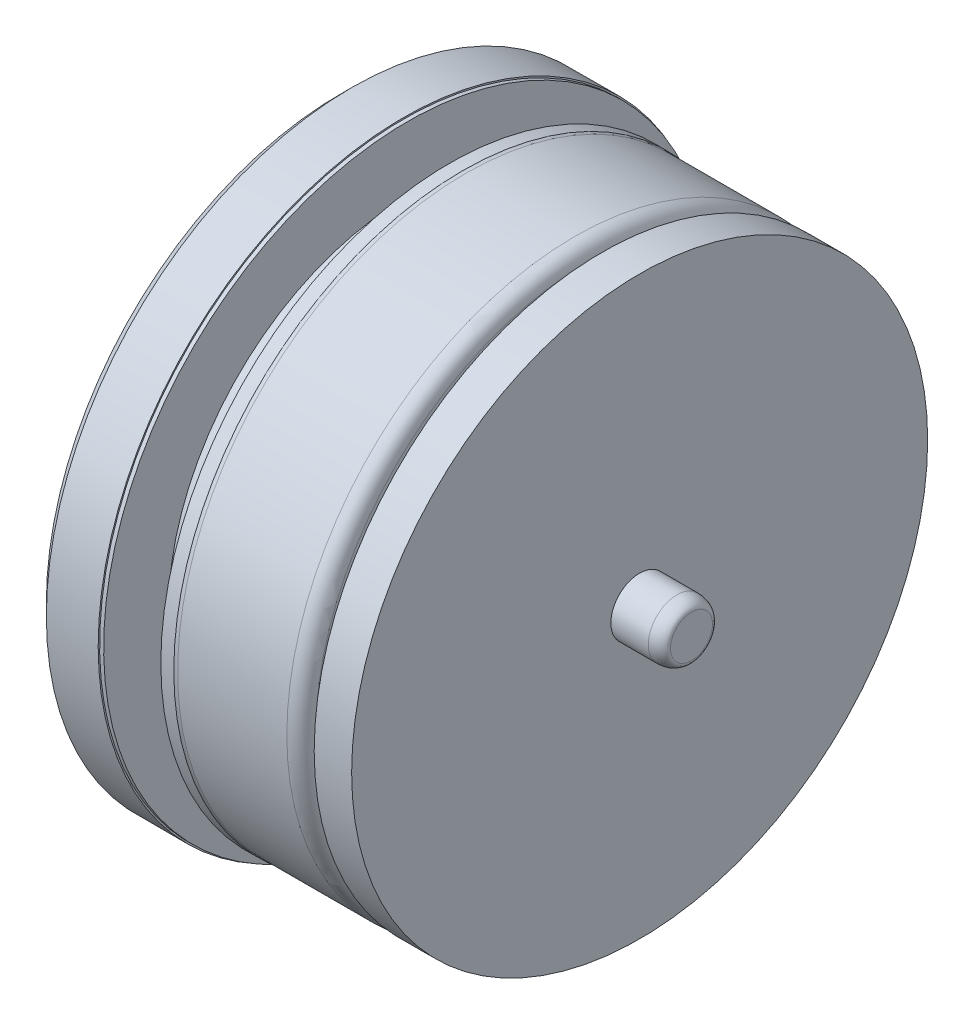
ISO-10303-21;
HEADER;
FILE_DESCRIPTION(('STEP AP214'),'2;1');
FILE_NAME('part.step','',(''),(''),'','','');
FILE_SCHEMA(('AUTOMOTIVE_DESIGN { 1 0 10303 214 1 1 1 1 }'));
ENDSEC;
DATA;
#1=APPLICATION_CONTEXT('core data for automotive mechanical design processes');
#2=APPLICATION_PROTOCOL_DEFINITION('international standard','automotive_design',2000,#1);
#3=PRODUCT_CONTEXT('',#1,'mechanical');
#4=PRODUCT('Part','Part','',(#3));
#5=PRODUCT_RELATED_PRODUCT_CATEGORY('part','',(#4));
#6=PRODUCT_DEFINITION_FORMATION('','',#4);
#7=PRODUCT_DEFINITION_CONTEXT('part definition',#1,'design');
#8=PRODUCT_DEFINITION('design','',#6,#7);
#9=PRODUCT_DEFINITION_SHAPE('','',#8);
#10=(LENGTH_UNIT() NAMED_UNIT(*) SI_UNIT(.MILLI.,.METRE.));
#11=(NAMED_UNIT(*) PLANE_ANGLE_UNIT() SI_UNIT($,.RADIAN.));
#12=(NAMED_UNIT(*) SI_UNIT($,.STERADIAN.) SOLID_ANGLE_UNIT());
#13=UNCERTAINTY_MEASURE_WITH_UNIT(LENGTH_MEASURE(1.E-05),#10,'distance_accuracy_value','');
#14=(GEOMETRIC_REPRESENTATION_CONTEXT(3) GLOBAL_UNCERTAINTY_ASSIGNED_CONTEXT((#13)) GLOBAL_UNIT_ASSIGNED_CONTEXT((#10,
#11,#12)) REPRESENTATION_CONTEXT('',''));
#15=CARTESIAN_POINT('',(0.,0.,0.));
#16=DIRECTION('',(0.,0.,1.));
#17=DIRECTION('',(1.,0.,0.));
#18=AXIS2_PLACEMENT_3D('',#15,#16,#17);
#19=CARTESIAN_POINT('',(10.,0.,0.));
#20=DIRECTION('',(-1.,0.,0.));
#21=DIRECTION('',(0.,0.,1.));
#22=AXIS2_PLACEMENT_3D('',#19,#20,#21);
#23=PLANE('',#22);
#24=CARTESIAN_POINT('',(10.,0.,0.));
#25=DIRECTION('',(-1.,0.,0.));
#26=DIRECTION('',(0.,1.,0.));
#27=AXIS2_PLACEMENT_3D('',#24,#25,#26);
#28=CIRCLE('',#27,0.73);
#29=CARTESIAN_POINT('',(10.,0.73,0.));
#30=VERTEX_POINT('',#29);
#31=CARTESIAN_POINT('',(10.,-0.73,0.));
#32=VERTEX_POINT('',#31);
#33=EDGE_CURVE('E85',#30,#32,#28,.T.);
#34=ORIENTED_EDGE('',*,*,#33,.F.);
#35=CARTESIAN_POINT('',(10.,0.,0.));
#36=DIRECTION('',(-1.,0.,0.));
#37=DIRECTION('',(0.,-1.,0.));
#38=AXIS2_PLACEMENT_3D('',#35,#36,#37);
#39=CIRCLE('',#38,0.73);
#40=EDGE_CURVE('E809',#32,#30,#39,.T.);
#41=ORIENTED_EDGE('',*,*,#40,.F.);
#42=EDGE_LOOP('',(#34,#41));
#43=FACE_BOUND('',#42,.T.);
#44=ADVANCED_FACE('F15',(#43),#23,.F.);
#45=CARTESIAN_POINT('',(10.,0.73,0.));
#46=CARTESIAN_POINT('',(10.,0.7941666666667,0.));
#47=CARTESIAN_POINT('',(9.943068193887,0.8655681938875,0.));
#48=CARTESIAN_POINT('',(9.787543930705,0.9667105973716,0.));
#49=CARTESIAN_POINT('',(9.628333333333,1.,0.));
#50=CARTESIAN_POINT('',(9.5,1.,0.));
#51=(BOUNDED_CURVE() B_SPLINE_CURVE(3,(#45,#46,#47,#48,#49,#50),.UNSPECIFIED.,.F.,
.F.) B_SPLINE_CURVE_WITH_KNOTS((4,1,1,4),(0.,0.25,0.5,1.),
.UNSPECIFIED.) CURVE() GEOMETRIC_REPRESENTATION_ITEM() RATIONAL_B_SPLINE_CURVE((1.,1.,1.,1.,1.,1.)) REPRESENTATION_ITEM(''));
#52=CARTESIAN_POINT('',(10.925,0.,0.));
#53=DIRECTION('',(1.,0.,0.));
#54=AXIS1_PLACEMENT('',#52,#53);
#55=SURFACE_OF_REVOLUTION('',#51,#54);
#56=CARTESIAN_POINT('',(9.5,0.,0.));
#57=DIRECTION('',(-1.,0.,0.));
#58=DIRECTION('',(0.,0.,1.));
#59=AXIS2_PLACEMENT_3D('',#56,#57,#58);
#60=CIRCLE('',#59,1.);
#61=CARTESIAN_POINT('',(9.5,0.,1.));
#62=VERTEX_POINT('',#61);
#63=EDGE_CURVE('E267',#62,#62,#60,.T.);
#64=ORIENTED_EDGE('',*,*,#63,.F.);
#65=EDGE_LOOP('',(#64));
#66=FACE_BOUND('',#65,.T.);
#67=ORIENTED_EDGE('',*,*,#40,.T.);
#68=ORIENTED_EDGE('',*,*,#33,.T.);
#69=EDGE_LOOP('',(#67,#68));
#70=FACE_BOUND('',#69,.T.);
#71=ADVANCED_FACE('F272',(#66,#70),#55,.F.);
#72=CARTESIAN_POINT('',(10.925,0.,0.));
#73=DIRECTION('',(-1.,0.,0.));
#74=DIRECTION('',(0.,0.,1.));
#75=AXIS2_PLACEMENT_3D('',#72,#73,#74);
#76=CYLINDRICAL_SURFACE('',#75,1.);
#77=CARTESIAN_POINT('',(8.2,0.,0.));
#78=DIRECTION('',(-1.,0.,0.));
#79=DIRECTION('',(0.,0.,1.));
#80=AXIS2_PLACEMENT_3D('',#77,#78,#79);
#81=CIRCLE('',#80,1.);
#82=CARTESIAN_POINT('',(8.2,0.,1.));
#83=VERTEX_POINT('',#82);
#84=EDGE_CURVE('E772',#83,#83,#81,.F.);
#85=ORIENTED_EDGE('',*,*,#84,.T.);
#86=EDGE_LOOP('',(#85));
#87=FACE_BOUND('',#86,.T.);
#88=ORIENTED_EDGE('',*,*,#63,.T.);
#89=EDGE_LOOP('',(#88));
#90=FACE_BOUND('',#89,.T.);
#91=ADVANCED_FACE('F276',(#87,#90),#76,.T.);
#92=CARTESIAN_POINT('',(8.2,0.,0.));
#93=DIRECTION('',(-1.,0.,0.));
#94=DIRECTION('',(0.,0.,1.));
#95=AXIS2_PLACEMENT_3D('',#92,#93,#94);
#96=PLANE('',#95);
#97=ORIENTED_EDGE('',*,*,#84,.F.);
#98=EDGE_LOOP('',(#97));
#99=FACE_BOUND('',#98,.T.);
#100=CARTESIAN_POINT('',(8.2,0.,0.));
#101=DIRECTION('',(-1.,0.,0.));
#102=DIRECTION('',(0.,0.,1.));
#103=AXIS2_PLACEMENT_3D('',#100,#101,#102);
#104=CIRCLE('',#103,10.);
#105=CARTESIAN_POINT('',(8.2,0.,10.));
#106=VERTEX_POINT('',#105);
#107=EDGE_CURVE('E769',#106,#106,#104,.T.);
#108=ORIENTED_EDGE('',*,*,#107,.F.);
#109=EDGE_LOOP('',(#108));
#110=FACE_BOUND('',#109,.T.);
#111=ADVANCED_FACE('F327',(#99,#110),#96,.F.);
#112=CARTESIAN_POINT('',(10.925,0.,0.));
#113=DIRECTION('',(-1.,0.,0.));
#114=DIRECTION('',(0.,0.,1.));
#115=AXIS2_PLACEMENT_3D('',#112,#113,#114);
#116=CYLINDRICAL_SURFACE('',#115,10.);
#117=CARTESIAN_POINT('',(6.9,0.,0.));
#118=DIRECTION('',(-1.,0.,0.));
#119=DIRECTION('',(0.,0.,1.));
#120=AXIS2_PLACEMENT_3D('',#117,#118,#119);
#121=CIRCLE('',#120,10.);
#122=CARTESIAN_POINT('',(6.9,0.,10.));
#123=VERTEX_POINT('',#122);
#124=EDGE_CURVE('E765',#123,#123,#121,.T.);
#125=ORIENTED_EDGE('',*,*,#124,.F.);
#126=EDGE_LOOP('',(#125));
#127=FACE_BOUND('',#126,.T.);
#128=ORIENTED_EDGE('',*,*,#107,.T.);
#129=EDGE_LOOP('',(#128));
#130=FACE_BOUND('',#129,.T.);
#131=ADVANCED_FACE('F335',(#127,#130),#116,.T.);
#132=CARTESIAN_POINT('',(-8.5,0.,0.));
#133=DIRECTION('',(-1.,0.,0.));
#134=DIRECTION('',(0.,0.,1.));
#135=AXIS2_PLACEMENT_3D('',#132,#133,#134);
#136=PLANE('',#135);
#137=CARTESIAN_POINT('',(-8.5,0.,0.));
#138=DIRECTION('',(1.,0.,0.));
#139=DIRECTION('',(0.,1.,0.));
#140=AXIS2_PLACEMENT_3D('',#137,#138,#139);
#141=CIRCLE('',#140,0.73);
#142=CARTESIAN_POINT('',(-8.5,0.73,0.));
#143=VERTEX_POINT('',#142);
#144=CARTESIAN_POINT('',(-8.5,-0.73,0.));
#145=VERTEX_POINT('',#144);
#146=EDGE_CURVE('E768',#143,#145,#141,.T.);
#147=ORIENTED_EDGE('',*,*,#146,.F.);
#148=CARTESIAN_POINT('',(-8.5,0.,0.));
#149=DIRECTION('',(1.,0.,0.));
#150=DIRECTION('',(0.,-1.,0.));
#151=AXIS2_PLACEMENT_3D('',#148,#149,#150);
#152=CIRCLE('',#151,0.73);
#153=EDGE_CURVE('E764',#145,#143,#152,.T.);
#154=ORIENTED_EDGE('',*,*,#153,.F.);
#155=EDGE_LOOP('',(#147,#154));
#156=FACE_BOUND('',#155,.T.);
#157=ADVANCED_FACE('F344',(#156),#136,.T.);
#158=CARTESIAN_POINT('',(6.9,0.,0.));
#159=DIRECTION('',(-1.,0.,0.));
#160=DIRECTION('',(0.,0.,1.));
#161=AXIS2_PLACEMENT_3D('',#158,#159,#160);
#162=PLANE('',#161);
#163=CARTESIAN_POINT('',(6.89999999999973,0.,0.));
#164=DIRECTION('',(-1.,0.,0.));
#165=DIRECTION('',(0.,0.,1.));
#166=AXIS2_PLACEMENT_3D('',#163,#164,#165);
#167=CIRCLE('',#166,8.76019237886453);
#168=CARTESIAN_POINT('',(6.89999999999973,0.,8.76019237886453));
#169=VERTEX_POINT('',#168);
#170=EDGE_CURVE('E761',#169,#169,#167,.T.);
#171=ORIENTED_EDGE('',*,*,#170,.F.);
#172=EDGE_LOOP('',(#171));
#173=FACE_BOUND('',#172,.T.);
#174=ORIENTED_EDGE('',*,*,#124,.T.);
#175=EDGE_LOOP('',(#174));
#176=FACE_BOUND('',#175,.T.);
#177=ADVANCED_FACE('F243',(#173,#176),#162,.T.);
#178=CARTESIAN_POINT('',(-8.,1.,0.));
#179=CARTESIAN_POINT('',(-8.128333333333,1.,0.));
#180=CARTESIAN_POINT('',(-8.287543930705,0.9667105973716,0.));
#181=CARTESIAN_POINT('',(-8.443068193887,0.8655681938875,0.));
#182=CARTESIAN_POINT('',(-8.5,0.7941666666666,0.));
#183=CARTESIAN_POINT('',(-8.5,0.73,0.));
#184=(BOUNDED_CURVE() B_SPLINE_CURVE(3,(#178,#179,#180,#181,#182,#183),.UNSPECIFIED.,.F.,
.F.) B_SPLINE_CURVE_WITH_KNOTS((4,1,1,4),(0.,0.5,0.75,1.),
.UNSPECIFIED.) CURVE() GEOMETRIC_REPRESENTATION_ITEM() RATIONAL_B_SPLINE_CURVE((1.,1.,1.,1.,1.,1.)) REPRESENTATION_ITEM(''));
#185=CARTESIAN_POINT('',(10.925,0.,0.));
#186=DIRECTION('',(1.,0.,0.));
#187=AXIS1_PLACEMENT('',#185,#186);
#188=SURFACE_OF_REVOLUTION('',#184,#187);
#189=ORIENTED_EDGE('',*,*,#146,.T.);
#190=ORIENTED_EDGE('',*,*,#153,.T.);
#191=EDGE_LOOP('',(#189,#190));
#192=FACE_BOUND('',#191,.T.);
#193=CARTESIAN_POINT('',(-8.,0.,0.));
#194=DIRECTION('',(-1.,0.,0.));
#195=DIRECTION('',(0.,0.,1.));
#196=AXIS2_PLACEMENT_3D('',#193,#194,#195);
#197=CIRCLE('',#196,1.);
#198=CARTESIAN_POINT('',(-8.,0.,1.));
#199=VERTEX_POINT('',#198);
#200=EDGE_CURVE('E232',#199,#199,#197,.F.);
#201=ORIENTED_EDGE('',*,*,#200,.F.);
#202=EDGE_LOOP('',(#201));
#203=FACE_BOUND('',#202,.T.);
#204=ADVANCED_FACE('F238',(#192,#203),#188,.F.);
#205=CARTESIAN_POINT('',(6.44999999999984,0.,0.));
#206=DIRECTION('',(-1.,0.,0.));
#207=DIRECTION('',(0.,0.,1.));
#208=AXIS2_PLACEMENT_3D('',#205,#206,#207);
#209=CONICAL_SURFACE('',#208,9.01999999999973,0.523598775598197);
#210=ORIENTED_EDGE('',*,*,#170,.T.);
#211=EDGE_LOOP('',(#210));
#212=FACE_BOUND('',#211,.T.);
#213=CARTESIAN_POINT('',(6.44999999999984,0.,0.));
#214=DIRECTION('',(-1.,0.,0.));
#215=DIRECTION('',(0.,0.,1.));
#216=AXIS2_PLACEMENT_3D('',#213,#214,#215);
#217=CIRCLE('',#216,9.01999999999973);
#218=CARTESIAN_POINT('',(6.44999999999984,0.,9.01999999999973));
#219=VERTEX_POINT('',#218);
#220=EDGE_CURVE('E758',#219,#219,#217,.F.);
#221=ORIENTED_EDGE('',*,*,#220,.T.);
#222=EDGE_LOOP('',(#221));
#223=FACE_BOUND('',#222,.T.);
#224=ADVANCED_FACE('F242',(#212,#223),#209,.T.);
#225=CARTESIAN_POINT('',(10.925,0.,0.));
#226=DIRECTION('',(-1.,0.,0.));
#227=DIRECTION('',(0.,0.,1.));
#228=AXIS2_PLACEMENT_3D('',#225,#226,#227);
#229=CYLINDRICAL_SURFACE('',#228,1.);
#230=CARTESIAN_POINT('',(-2.7,0.,0.));
#231=DIRECTION('',(-1.,0.,0.));
#232=DIRECTION('',(0.,0.,1.));
#233=AXIS2_PLACEMENT_3D('',#230,#231,#232);
#234=CIRCLE('',#233,1.);
#235=CARTESIAN_POINT('',(-2.7,0.,1.));
#236=VERTEX_POINT('',#235);
#237=EDGE_CURVE('E755',#236,#236,#234,.F.);
#238=ORIENTED_EDGE('',*,*,#237,.F.);
#239=EDGE_LOOP('',(#238));
#240=FACE_BOUND('',#239,.T.);
#241=ORIENTED_EDGE('',*,*,#200,.T.);
#242=EDGE_LOOP('',(#241));
#243=FACE_BOUND('',#242,.T.);
#244=ADVANCED_FACE('F206',(#240,#243),#229,.T.);
#245=CARTESIAN_POINT('',(6.45,0.,0.));
#246=DIRECTION('',(-1.,0.,0.));
#247=DIRECTION('',(0.,0.,1.));
#248=AXIS2_PLACEMENT_3D('',#245,#246,#247);
#249=PLANE('',#248);
#250=ORIENTED_EDGE('',*,*,#220,.F.);
#251=EDGE_LOOP('',(#250));
#252=FACE_BOUND('',#251,.T.);
#253=CARTESIAN_POINT('',(6.45,0.,0.));
#254=DIRECTION('',(-1.,0.,0.));
#255=DIRECTION('',(0.,-1.,0.));
#256=AXIS2_PLACEMENT_3D('',#253,#254,#255);
#257=CIRCLE('',#256,9.5);
#258=CARTESIAN_POINT('',(6.45,-9.5,0.));
#259=VERTEX_POINT('',#258);
#260=CARTESIAN_POINT('',(6.45,9.5,0.));
#261=VERTEX_POINT('',#260);
#262=EDGE_CURVE('E192',#259,#261,#257,.T.);
#263=ORIENTED_EDGE('',*,*,#262,.F.);
#264=CARTESIAN_POINT('',(6.45,0.,0.));
#265=DIRECTION('',(-1.,0.,0.));
#266=DIRECTION('',(0.,1.,0.));
#267=AXIS2_PLACEMENT_3D('',#264,#265,#266);
#268=CIRCLE('',#267,9.5);
#269=EDGE_CURVE('E219',#261,#259,#268,.T.);
#270=ORIENTED_EDGE('',*,*,#269,.F.);
#271=EDGE_LOOP('',(#263,#270));
#272=FACE_BOUND('',#271,.T.);
#273=ADVANCED_FACE('F197',(#252,#272),#249,.F.);
#274=CARTESIAN_POINT('',(-2.7,0.,0.));
#275=DIRECTION('',(-1.,0.,0.));
#276=DIRECTION('',(0.,0.,1.));
#277=AXIS2_PLACEMENT_3D('',#274,#275,#276);
#278=PLANE('',#277);
#279=ORIENTED_EDGE('',*,*,#237,.T.);
#280=EDGE_LOOP('',(#279));
#281=FACE_BOUND('',#280,.T.);
#282=CARTESIAN_POINT('',(-2.70000000000437,0.,0.));
#283=DIRECTION('',(-1.,0.,0.));
#284=DIRECTION('',(0.,0.,1.));
#285=AXIS2_PLACEMENT_3D('',#282,#283,#284);
#286=CIRCLE('',#285,3.00000000004274);
#287=CARTESIAN_POINT('',(-2.70000000000437,0.,3.00000000004274));
#288=VERTEX_POINT('',#287);
#289=EDGE_CURVE('E752',#288,#288,#286,.T.);
#290=ORIENTED_EDGE('',*,*,#289,.T.);
#291=EDGE_LOOP('',(#290));
#292=FACE_BOUND('',#291,.T.);
#293=ADVANCED_FACE('F178',(#281,#292),#278,.T.);
#294=CARTESIAN_POINT('',(5.95,0.,0.));
#295=DIRECTION('',(-1.,0.,0.));
#296=DIRECTION('',(0.,1.,0.));
#297=AXIS2_PLACEMENT_3D('',#294,#295,#296);
#298=TOROIDAL_SURFACE('',#297,9.5,0.5);
#299=CARTESIAN_POINT('',(5.95,0.,0.));
#300=DIRECTION('',(-1.,0.,0.));
#301=DIRECTION('',(0.,0.,1.));
#302=AXIS2_PLACEMENT_3D('',#299,#300,#301);
#303=CIRCLE('',#302,10.);
#304=CARTESIAN_POINT('',(5.95,0.,10.));
#305=VERTEX_POINT('',#304);
#306=EDGE_CURVE('E186',#305,#305,#303,.T.);
#307=ORIENTED_EDGE('',*,*,#306,.F.);
#308=EDGE_LOOP('',(#307));
#309=FACE_BOUND('',#308,.T.);
#310=ORIENTED_EDGE('',*,*,#269,.T.);
#311=ORIENTED_EDGE('',*,*,#262,.T.);
#312=EDGE_LOOP('',(#310,#311));
#313=FACE_BOUND('',#312,.T.);
#314=ADVANCED_FACE('F172',(#309,#313),#298,.T.);
#315=CARTESIAN_POINT('',(-3.19999999999254,0.,0.));
#316=DIRECTION('',(-1.,0.,0.));
#317=DIRECTION('',(0.,0.,1.));
#318=AXIS2_PLACEMENT_3D('',#315,#316,#317);
#319=CONICAL_SURFACE('',#318,3.28867513462683,0.523598775592442);
#320=ORIENTED_EDGE('',*,*,#289,.F.);
#321=EDGE_LOOP('',(#320));
#322=FACE_BOUND('',#321,.T.);
#323=CARTESIAN_POINT('',(-3.19999999999254,0.,0.));
#324=DIRECTION('',(-1.,0.,0.));
#325=DIRECTION('',(0.,0.,1.));
#326=AXIS2_PLACEMENT_3D('',#323,#324,#325);
#327=CIRCLE('',#326,3.28867513462683);
#328=CARTESIAN_POINT('',(-3.19999999999254,0.,3.28867513462683));
#329=VERTEX_POINT('',#328);
#330=EDGE_CURVE('E749',#329,#329,#327,.F.);
#331=ORIENTED_EDGE('',*,*,#330,.F.);
#332=EDGE_LOOP('',(#331));
#333=FACE_BOUND('',#332,.T.);
#334=ADVANCED_FACE('F168',(#322,#333),#319,.F.);
#335=CARTESIAN_POINT('',(10.925,0.,0.));
#336=DIRECTION('',(-1.,0.,0.));
#337=DIRECTION('',(0.,0.,1.));
#338=AXIS2_PLACEMENT_3D('',#335,#336,#337);
#339=CYLINDRICAL_SURFACE('',#338,10.);
#340=CARTESIAN_POINT('',(2.158972473588,0.,0.));
#341=DIRECTION('',(-1.,0.,0.));
#342=DIRECTION('',(0.,1.,0.));
#343=AXIS2_PLACEMENT_3D('',#340,#341,#342);
#344=CIRCLE('',#343,10.);
#345=CARTESIAN_POINT('',(2.158972473588,10.,0.));
#346=VERTEX_POINT('',#345);
#347=EDGE_CURVE('E748',#346,#346,#344,.F.);
#348=ORIENTED_EDGE('',*,*,#347,.T.);
#349=EDGE_LOOP('',(#348));
#350=FACE_BOUND('',#349,.T.);
#351=ORIENTED_EDGE('',*,*,#306,.T.);
#352=EDGE_LOOP('',(#351));
#353=FACE_BOUND('',#352,.T.);
#354=ADVANCED_FACE('F164',(#350,#353),#339,.T.);
#355=CARTESIAN_POINT('',(-3.2,0.,0.));
#356=DIRECTION('',(-1.,0.,0.));
#357=DIRECTION('',(0.,0.,1.));
#358=AXIS2_PLACEMENT_3D('',#355,#356,#357);
#359=PLANE('',#358);
#360=ORIENTED_EDGE('',*,*,#330,.T.);
#361=EDGE_LOOP('',(#360));
#362=FACE_BOUND('',#361,.T.);
#363=CARTESIAN_POINT('',(-3.2,0.,0.));
#364=DIRECTION('',(-1.,0.,0.));
#365=DIRECTION('',(0.,0.,1.));
#366=AXIS2_PLACEMENT_3D('',#363,#364,#365);
#367=CIRCLE('',#366,4.);
#368=CARTESIAN_POINT('',(-3.2,0.,4.));
#369=VERTEX_POINT('',#368);
#370=EDGE_CURVE('E744',#369,#369,#367,.F.);
#371=ORIENTED_EDGE('',*,*,#370,.F.);
#372=EDGE_LOOP('',(#371));
#373=FACE_BOUND('',#372,.T.);
#374=ADVANCED_FACE('F160',(#362,#373),#359,.T.);
#375=CARTESIAN_POINT('',(2.60000000008631,6.75,0.));
#376=DIRECTION('',(-1.,0.,0.));
#377=DIRECTION('',(0.,0.,1.));
#378=AXIS2_PLACEMENT_3D('',#375,#376,#377);
#379=CONICAL_SURFACE('',#378,0.799999999866941,1.0297442585965);
#380=CARTESIAN_POINT('',(3.08068849528809,6.75000000020987,0.));
#381=VERTEX_POINT('',#380);
#382=VERTEX_LOOP('',#381);
#383=FACE_BOUND('',#382,.T.);
#384=CARTESIAN_POINT('',(2.6,6.75,0.));
#385=DIRECTION('',(-1.,0.,0.));
#386=DIRECTION('',(0.,0.,1.));
#387=AXIS2_PLACEMENT_3D('',#384,#385,#386);
#388=CIRCLE('',#387,0.8);
#389=CARTESIAN_POINT('',(2.6,6.75,0.8));
#390=VERTEX_POINT('',#389);
#391=EDGE_CURVE('E747',#390,#390,#388,.T.);
#392=ORIENTED_EDGE('',*,*,#391,.T.);
#393=EDGE_LOOP('',(#392));
#394=FACE_BOUND('',#393,.T.);
#395=ADVANCED_FACE('F156',(#383,#394),#379,.F.);
#396=CARTESIAN_POINT('',(2.59999999997263,-3.375,-5.845671475545));
#397=DIRECTION('',(-1.,0.,0.));
#398=DIRECTION('',(0.,0.,1.));
#399=AXIS2_PLACEMENT_3D('',#396,#397,#398);
#400=CONICAL_SURFACE('',#399,0.800000000040061,1.02974425869595);
#401=CARTESIAN_POINT('',(3.0806884951744,-3.375,-5.845671475545));
#402=VERTEX_POINT('',#401);
#403=VERTEX_LOOP('',#402);
#404=FACE_BOUND('',#403,.T.);
#405=CARTESIAN_POINT('',(2.6,-3.375,-5.845671475545));
#406=DIRECTION('',(-1.,0.,0.));
#407=DIRECTION('',(0.,0.,1.));
#408=AXIS2_PLACEMENT_3D('',#405,#406,#407);
#409=CIRCLE('',#408,0.8);
#410=CARTESIAN_POINT('',(2.6,-3.375,-5.045671475545));
#411=VERTEX_POINT('',#410);
#412=EDGE_CURVE('E857',#411,#411,#409,.T.);
#413=ORIENTED_EDGE('',*,*,#412,.T.);
#414=EDGE_LOOP('',(#413));
#415=FACE_BOUND('',#414,.T.);
#416=ADVANCED_FACE('F153',(#404,#415),#400,.F.);
#417=CARTESIAN_POINT('',(2.59999999997263,-3.375,5.845671475545));
#418=DIRECTION('',(-1.,0.,0.));
#419=DIRECTION('',(0.,0.,1.));
#420=AXIS2_PLACEMENT_3D('',#417,#418,#419);
#421=CONICAL_SURFACE('',#420,0.800000000040061,1.02974425869595);
#422=CARTESIAN_POINT('',(3.0806884951744,-3.375,5.845671475545));
#423=VERTEX_POINT('',#422);
#424=VERTEX_LOOP('',#423);
#425=FACE_BOUND('',#424,.T.);
#426=CARTESIAN_POINT('',(2.6,-3.375,5.845671475545));
#427=DIRECTION('',(-1.,0.,0.));
#428=DIRECTION('',(0.,0.,1.));
#429=AXIS2_PLACEMENT_3D('',#426,#427,#428);
#430=CIRCLE('',#429,0.8);
#431=CARTESIAN_POINT('',(2.6,-3.375,6.645671475545));
#432=VERTEX_POINT('',#431);
#433=EDGE_CURVE('E128',#432,#432,#430,.T.);
#434=ORIENTED_EDGE('',*,*,#433,.T.);
#435=EDGE_LOOP('',(#434));
#436=FACE_BOUND('',#435,.T.);
#437=ADVANCED_FACE('F149',(#425,#436),#421,.F.);
#438=CARTESIAN_POINT('',(0.,0.,0.));
#439=DIRECTION('',(-1.,0.,0.));
#440=DIRECTION('',(0.,0.,1.));
#441=AXIS2_PLACEMENT_3D('',#438,#439,#440);
#442=PLANE('',#441);
#443=CARTESIAN_POINT('',(0.,2.35,4.070319397787));
#444=DIRECTION('',(1.,0.,0.));
#445=DIRECTION('',(0.,0.,-1.));
#446=AXIS2_PLACEMENT_3D('',#443,#444,#445);
#447=CIRCLE('',#446,0.4);
#448=CARTESIAN_POINT('',(0.,2.35,3.670319397787));
#449=VERTEX_POINT('',#448);
#450=EDGE_CURVE('E741',#449,#449,#447,.F.);
#451=ORIENTED_EDGE('',*,*,#450,.T.);
#452=EDGE_LOOP('',(#451));
#453=FACE_BOUND('',#452,.T.);
#454=ADVANCED_FACE('F145',(#453),#442,.T.);
#455=CARTESIAN_POINT('',(0.,0.,0.));
#456=DIRECTION('',(-1.,0.,0.));
#457=DIRECTION('',(0.,0.,1.));
#458=AXIS2_PLACEMENT_3D('',#455,#456,#457);
#459=PLANE('',#458);
#460=CARTESIAN_POINT('',(0.,-4.7,0.));
#461=DIRECTION('',(1.,0.,0.));
#462=DIRECTION('',(0.,0.,-1.));
#463=AXIS2_PLACEMENT_3D('',#460,#461,#462);
#464=CIRCLE('',#463,0.4);
#465=CARTESIAN_POINT('',(0.,-4.7,-0.4));
#466=VERTEX_POINT('',#465);
#467=EDGE_CURVE('E738',#466,#466,#464,.F.);
#468=ORIENTED_EDGE('',*,*,#467,.T.);
#469=EDGE_LOOP('',(#468));
#470=FACE_BOUND('',#469,.T.);
#471=ADVANCED_FACE('F141',(#470),#459,.T.);
#472=CARTESIAN_POINT('',(0.,0.,0.));
#473=DIRECTION('',(-1.,0.,0.));
#474=DIRECTION('',(0.,0.,1.));
#475=AXIS2_PLACEMENT_3D('',#472,#473,#474);
#476=PLANE('',#475);
#477=CARTESIAN_POINT('',(0.,2.35,-4.070319397787));
#478=DIRECTION('',(1.,0.,0.));
#479=DIRECTION('',(0.,0.,-1.));
#480=AXIS2_PLACEMENT_3D('',#477,#478,#479);
#481=CIRCLE('',#480,0.4);
#482=CARTESIAN_POINT('',(0.,2.35,-4.470319397787));
#483=VERTEX_POINT('',#482);
#484=EDGE_CURVE('E125',#483,#483,#481,.F.);
#485=ORIENTED_EDGE('',*,*,#484,.T.);
#486=EDGE_LOOP('',(#485));
#487=FACE_BOUND('',#486,.T.);
#488=ADVANCED_FACE('F136',(#487),#476,.T.);
#489=CARTESIAN_POINT('',(2.158972473588,0.,0.));
#490=DIRECTION('',(-1.,0.,0.));
#491=DIRECTION('',(0.,1.,0.));
#492=AXIS2_PLACEMENT_3D('',#489,#490,#491);
#493=TOROIDAL_SURFACE('',#492,10.25,0.25);
#494=CARTESIAN_POINT('',(2.05,0.,0.));
#495=DIRECTION('',(-1.,0.,0.));
#496=DIRECTION('',(0.,0.,1.));
#497=AXIS2_PLACEMENT_3D('',#494,#495,#496);
#498=CIRCLE('',#497,10.025);
#499=CARTESIAN_POINT('',(2.05,0.,10.025));
#500=VERTEX_POINT('',#499);
#501=EDGE_CURVE('E121',#500,#500,#498,.T.);
#502=ORIENTED_EDGE('',*,*,#501,.F.);
#503=EDGE_LOOP('',(#502));
#504=FACE_BOUND('',#503,.T.);
#505=ORIENTED_EDGE('',*,*,#347,.F.);
#506=EDGE_LOOP('',(#505));
#507=FACE_BOUND('',#506,.T.);
#508=ADVANCED_FACE('F131',(#504,#507),#493,.F.);
#509=CARTESIAN_POINT('',(10.925,0.,0.));
#510=DIRECTION('',(-1.,0.,0.));
#511=DIRECTION('',(0.,0.,1.));
#512=AXIS2_PLACEMENT_3D('',#509,#510,#511);
#513=CYLINDRICAL_SURFACE('',#512,4.);
#514=CARTESIAN_POINT('',(-2.2,0.,0.));
#515=DIRECTION('',(-1.,0.,0.));
#516=DIRECTION('',(0.,0.,1.));
#517=AXIS2_PLACEMENT_3D('',#514,#515,#516);
#518=CIRCLE('',#517,4.);
#519=CARTESIAN_POINT('',(-2.2,0.,4.));
#520=VERTEX_POINT('',#519);
#521=EDGE_CURVE('E124',#520,#520,#518,.F.);
#522=ORIENTED_EDGE('',*,*,#521,.F.);
#523=EDGE_LOOP('',(#522));
#524=FACE_BOUND('',#523,.T.);
#525=ORIENTED_EDGE('',*,*,#370,.T.);
#526=EDGE_LOOP('',(#525));
#527=FACE_BOUND('',#526,.T.);
#528=ADVANCED_FACE('F135',(#524,#527),#513,.T.);
#529=CARTESIAN_POINT('',(3.344722919983,6.75,0.));
#530=DIRECTION('',(-1.,0.,0.));
#531=DIRECTION('',(0.,0.,1.));
#532=AXIS2_PLACEMENT_3D('',#529,#530,#531);
#533=CYLINDRICAL_SURFACE('',#532,0.8);
#534=ORIENTED_EDGE('',*,*,#391,.F.);
#535=EDGE_LOOP('',(#534));
#536=FACE_BOUND('',#535,.T.);
#537=CARTESIAN_POINT('',(-2.2,6.75,0.));
#538=DIRECTION('',(-1.,0.,0.));
#539=DIRECTION('',(0.,0.,1.));
#540=AXIS2_PLACEMENT_3D('',#537,#538,#539);
#541=CIRCLE('',#540,0.8);
#542=CARTESIAN_POINT('',(-2.2,6.75,0.8));
#543=VERTEX_POINT('',#542);
#544=EDGE_CURVE('E731',#543,#543,#541,.F.);
#545=ORIENTED_EDGE('',*,*,#544,.F.);
#546=EDGE_LOOP('',(#545));
#547=FACE_BOUND('',#546,.T.);
#548=ADVANCED_FACE('F444',(#536,#547),#533,.F.);
#549=CARTESIAN_POINT('',(3.344722919983,-3.375,-5.845671475545));
#550=DIRECTION('',(-1.,0.,0.));
#551=DIRECTION('',(0.,0.,1.));
#552=AXIS2_PLACEMENT_3D('',#549,#550,#551);
#553=CYLINDRICAL_SURFACE('',#552,0.8);
#554=ORIENTED_EDGE('',*,*,#412,.F.);
#555=EDGE_LOOP('',(#554));
#556=FACE_BOUND('',#555,.T.);
#557=CARTESIAN_POINT('',(-2.2,-3.375,-5.845671475545));
#558=DIRECTION('',(-1.,0.,0.));
#559=DIRECTION('',(0.,0.,1.));
#560=AXIS2_PLACEMENT_3D('',#557,#558,#559);
#561=CIRCLE('',#560,0.8);
#562=CARTESIAN_POINT('',(-2.2,-3.375,-5.045671475545));
#563=VERTEX_POINT('',#562);
#564=EDGE_CURVE('E728',#563,#563,#561,.F.);
#565=ORIENTED_EDGE('',*,*,#564,.F.);
#566=EDGE_LOOP('',(#565));
#567=FACE_BOUND('',#566,.T.);
#568=ADVANCED_FACE('F452',(#556,#567),#553,.F.);
#569=CARTESIAN_POINT('',(3.344722919983,-3.375,5.845671475545));
#570=DIRECTION('',(-1.,0.,0.));
#571=DIRECTION('',(0.,0.,1.));
#572=AXIS2_PLACEMENT_3D('',#569,#570,#571);
#573=CYLINDRICAL_SURFACE('',#572,0.8);
#574=ORIENTED_EDGE('',*,*,#433,.F.);
#575=EDGE_LOOP('',(#574));
#576=FACE_BOUND('',#575,.T.);
#577=CARTESIAN_POINT('',(-2.2,-3.375,5.845671475545));
#578=DIRECTION('',(-1.,0.,0.));
#579=DIRECTION('',(0.,0.,1.));
#580=AXIS2_PLACEMENT_3D('',#577,#578,#579);
#581=CIRCLE('',#580,0.8);
#582=CARTESIAN_POINT('',(-2.2,-3.375,6.645671475545));
#583=VERTEX_POINT('',#582);
#584=EDGE_CURVE('E725',#583,#583,#581,.F.);
#585=ORIENTED_EDGE('',*,*,#584,.F.);
#586=EDGE_LOOP('',(#585));
#587=FACE_BOUND('',#586,.T.);
#588=ADVANCED_FACE('F460',(#576,#587),#573,.F.);
#589=CARTESIAN_POINT('',(-2.2,2.35,4.070319397787));
#590=DIRECTION('',(1.,0.,0.));
#591=DIRECTION('',(0.,0.,-1.));
#592=AXIS2_PLACEMENT_3D('',#589,#590,#591);
#593=CYLINDRICAL_SURFACE('',#592,0.4);
#594=ORIENTED_EDGE('',*,*,#450,.F.);
#595=EDGE_LOOP('',(#594));
#596=FACE_BOUND('',#595,.T.);
#597=CARTESIAN_POINT('',(-2.2,2.35,4.070319397787));
#598=DIRECTION('',(1.,0.,0.));
#599=DIRECTION('',(0.,0.,-1.));
#600=AXIS2_PLACEMENT_3D('',#597,#598,#599);
#601=CIRCLE('',#600,0.4);
#602=CARTESIAN_POINT('',(-2.2,2.35,3.670319397787));
#603=VERTEX_POINT('',#602);
#604=EDGE_CURVE('E722',#603,#603,#601,.T.);
#605=ORIENTED_EDGE('',*,*,#604,.F.);
#606=EDGE_LOOP('',(#605));
#607=FACE_BOUND('',#606,.T.);
#608=ADVANCED_FACE('F469',(#596,#607),#593,.F.);
#609=CARTESIAN_POINT('',(-2.2,-4.7,0.));
#610=DIRECTION('',(1.,0.,0.));
#611=DIRECTION('',(0.,0.,-1.));
#612=AXIS2_PLACEMENT_3D('',#609,#610,#611);
#613=CYLINDRICAL_SURFACE('',#612,0.4);
#614=ORIENTED_EDGE('',*,*,#467,.F.);
#615=EDGE_LOOP('',(#614));
#616=FACE_BOUND('',#615,.T.);
#617=CARTESIAN_POINT('',(-2.2,-4.7,0.));
#618=DIRECTION('',(1.,0.,0.));
#619=DIRECTION('',(0.,0.,-1.));
#620=AXIS2_PLACEMENT_3D('',#617,#618,#619);
#621=CIRCLE('',#620,0.4);
#622=CARTESIAN_POINT('',(-2.2,-4.7,-0.4));
#623=VERTEX_POINT('',#622);
#624=EDGE_CURVE('E719',#623,#623,#621,.T.);
#625=ORIENTED_EDGE('',*,*,#624,.F.);
#626=EDGE_LOOP('',(#625));
#627=FACE_BOUND('',#626,.T.);
#628=ADVANCED_FACE('F478',(#616,#627),#613,.F.);
#629=CARTESIAN_POINT('',(-2.2,2.35,-4.070319397787));
#630=DIRECTION('',(1.,0.,0.));
#631=DIRECTION('',(0.,0.,-1.));
#632=AXIS2_PLACEMENT_3D('',#629,#630,#631);
#633=CYLINDRICAL_SURFACE('',#632,0.4);
#634=ORIENTED_EDGE('',*,*,#484,.F.);
#635=EDGE_LOOP('',(#634));
#636=FACE_BOUND('',#635,.T.);
#637=CARTESIAN_POINT('',(-2.2,2.35,-4.070319397787));
#638=DIRECTION('',(1.,0.,0.));
#639=DIRECTION('',(0.,0.,-1.));
#640=AXIS2_PLACEMENT_3D('',#637,#638,#639);
#641=CIRCLE('',#640,0.4);
#642=CARTESIAN_POINT('',(-2.2,2.35,-4.470319397787));
#643=VERTEX_POINT('',#642);
#644=EDGE_CURVE('E716',#643,#643,#641,.T.);
#645=ORIENTED_EDGE('',*,*,#644,.F.);
#646=EDGE_LOOP('',(#645));
#647=FACE_BOUND('',#646,.T.);
#648=ADVANCED_FACE('F487',(#636,#647),#633,.F.);
#649=CARTESIAN_POINT('',(10.925,0.,0.));
#650=DIRECTION('',(-1.,0.,0.));
#651=DIRECTION('',(0.,0.,1.));
#652=AXIS2_PLACEMENT_3D('',#649,#650,#651);
#653=CYLINDRICAL_SURFACE('',#652,10.025);
#654=CARTESIAN_POINT('',(1.6,0.,0.));
#655=DIRECTION('',(-1.,0.,0.));
#656=DIRECTION('',(0.,0.,1.));
#657=AXIS2_PLACEMENT_3D('',#654,#655,#656);
#658=CIRCLE('',#657,10.025);
#659=CARTESIAN_POINT('',(1.6,0.,10.025));
#660=VERTEX_POINT('',#659);
#661=EDGE_CURVE('E713',#660,#660,#658,.T.);
#662=ORIENTED_EDGE('',*,*,#661,.F.);
#663=EDGE_LOOP('',(#662));
#664=FACE_BOUND('',#663,.T.);
#665=ORIENTED_EDGE('',*,*,#501,.T.);
#666=EDGE_LOOP('',(#665));
#667=FACE_BOUND('',#666,.T.);
#668=ADVANCED_FACE('F496',(#664,#667),#653,.T.);
#669=CARTESIAN_POINT('',(-2.2,0.,0.));
#670=DIRECTION('',(-1.,0.,0.));
#671=DIRECTION('',(0.,0.,1.));
#672=AXIS2_PLACEMENT_3D('',#669,#670,#671);
#673=PLANE('',#672);
#674=CARTESIAN_POINT('',(-2.2,0.,0.));
#675=DIRECTION('',(-1.,0.,0.));
#676=DIRECTION('',(0.,0.,1.));
#677=AXIS2_PLACEMENT_3D('',#674,#675,#676);
#678=CIRCLE('',#677,10.2);
#679=CARTESIAN_POINT('',(-2.2,0.,10.2));
#680=VERTEX_POINT('',#679);
#681=EDGE_CURVE('E10',#680,#680,#678,.T.);
#682=ORIENTED_EDGE('',*,*,#681,.T.);
#683=EDGE_LOOP('',(#682));
#684=FACE_BOUND('',#683,.T.);
#685=ORIENTED_EDGE('',*,*,#644,.T.);
#686=EDGE_LOOP('',(#685));
#687=FACE_BOUND('',#686,.T.);
#688=ORIENTED_EDGE('',*,*,#624,.T.);
#689=EDGE_LOOP('',(#688));
#690=FACE_BOUND('',#689,.T.);
#691=ORIENTED_EDGE('',*,*,#604,.T.);
#692=EDGE_LOOP('',(#691));
#693=FACE_BOUND('',#692,.T.);
#694=ORIENTED_EDGE('',*,*,#584,.T.);
#695=EDGE_LOOP('',(#694));
#696=FACE_BOUND('',#695,.T.);
#697=ORIENTED_EDGE('',*,*,#564,.T.);
#698=EDGE_LOOP('',(#697));
#699=FACE_BOUND('',#698,.T.);
#700=ORIENTED_EDGE('',*,*,#544,.T.);
#701=EDGE_LOOP('',(#700));
#702=FACE_BOUND('',#701,.T.);
#703=ORIENTED_EDGE('',*,*,#521,.T.);
#704=EDGE_LOOP('',(#703));
#705=FACE_BOUND('',#704,.T.);
#706=ADVANCED_FACE('F505',(#684,#687,#690,#693,#696,#699,#702,#705),#673,.T.);
#707=CARTESIAN_POINT('',(1.6,0.,0.));
#708=DIRECTION('',(-1.,0.,0.));
#709=DIRECTION('',(0.,0.,1.));
#710=AXIS2_PLACEMENT_3D('',#707,#708,#709);
#711=PLANE('',#710);
#712=CARTESIAN_POINT('',(1.6,0.,0.));
#713=DIRECTION('',(-1.,0.,0.));
#714=DIRECTION('',(0.,0.,1.));
#715=AXIS2_PLACEMENT_3D('',#712,#713,#714);
#716=CIRCLE('',#715,9.4);
#717=CARTESIAN_POINT('',(1.6,0.,9.4));
#718=VERTEX_POINT('',#717);
#719=EDGE_CURVE('E120',#718,#718,#716,.T.);
#720=ORIENTED_EDGE('',*,*,#719,.F.);
#721=EDGE_LOOP('',(#720));
#722=FACE_BOUND('',#721,.T.);
#723=ORIENTED_EDGE('',*,*,#661,.T.);
#724=EDGE_LOOP('',(#723));
#725=FACE_BOUND('',#724,.T.);
#726=ADVANCED_FACE('F513',(#722,#725),#711,.T.);
#727=CARTESIAN_POINT('',(10.925,0.,0.));
#728=DIRECTION('',(-1.,0.,0.));
#729=DIRECTION('',(0.,0.,1.));
#730=AXIS2_PLACEMENT_3D('',#727,#728,#729);
#731=CYLINDRICAL_SURFACE('',#730,10.6);
#732=CARTESIAN_POINT('',(-1.8,0.,0.));
#733=DIRECTION('',(-1.,0.,0.));
#734=DIRECTION('',(0.,0.,1.));
#735=AXIS2_PLACEMENT_3D('',#732,#733,#734);
#736=CIRCLE('',#735,10.6);
#737=CARTESIAN_POINT('',(-1.8,0.,10.6));
#738=VERTEX_POINT('',#737);
#739=EDGE_CURVE('E23',#738,#738,#736,.F.);
#740=ORIENTED_EDGE('',*,*,#739,.T.);
#741=EDGE_LOOP('',(#740));
#742=FACE_BOUND('',#741,.T.);
#743=CARTESIAN_POINT('',(0.,0.,0.));
#744=DIRECTION('',(-1.,0.,0.));
#745=DIRECTION('',(0.,0.,1.));
#746=AXIS2_PLACEMENT_3D('',#743,#744,#745);
#747=CIRCLE('',#746,10.6);
#748=CARTESIAN_POINT('',(0.,-10.1666120217105,3.));
#749=VERTEX_POINT('',#748);
#750=CARTESIAN_POINT('',(0.,-10.1666120217105,-3.));
#751=VERTEX_POINT('',#750);
#752=EDGE_CURVE('E98',#749,#751,#747,.T.);
#753=ORIENTED_EDGE('',*,*,#752,.T.);
#754=DIRECTION('',(-1.,0.,0.));
#755=VECTOR('',#754,1.);
#756=CARTESIAN_POINT('',(10.0012539936204,-10.1666120217105,-3.));
#757=LINE('',#756,#755);
#758=CARTESIAN_POINT('',(0.14,-10.1666120217105,-3.));
#759=VERTEX_POINT('',#758);
#760=EDGE_CURVE('E30',#759,#751,#757,.T.);
#761=ORIENTED_EDGE('',*,*,#760,.F.);
#762=CARTESIAN_POINT('',(0.14,0.,0.));
#763=DIRECTION('',(-1.,0.,0.));
#764=DIRECTION('',(0.,0.,1.));
#765=AXIS2_PLACEMENT_3D('',#762,#763,#764);
#766=CIRCLE('',#765,10.5999999999995);
#767=CARTESIAN_POINT('',(0.14,-10.1666120217105,3.));
#768=VERTEX_POINT('',#767);
#769=EDGE_CURVE('E90',#768,#759,#766,.F.);
#770=ORIENTED_EDGE('',*,*,#769,.F.);
#771=DIRECTION('',(-1.,0.,0.));
#772=VECTOR('',#771,1.);
#773=CARTESIAN_POINT('',(10.0012539936204,-10.1666120217105,3.));
#774=LINE('',#773,#772);
#775=EDGE_CURVE('E95',#768,#749,#774,.T.);
#776=ORIENTED_EDGE('',*,*,#775,.T.);
#777=EDGE_LOOP('',(#753,#761,#770,#776));
#778=FACE_BOUND('',#777,.T.);
#779=ADVANCED_FACE('F97',(#742,#778),#731,.T.);
#780=CARTESIAN_POINT('',(10.925,0.,0.));
#781=DIRECTION('',(-1.,0.,0.));
#782=DIRECTION('',(0.,0.,1.));
#783=AXIS2_PLACEMENT_3D('',#780,#781,#782);
#784=CYLINDRICAL_SURFACE('',#783,9.4);
#785=CARTESIAN_POINT('',(1.35,0.,0.));
#786=DIRECTION('',(-1.,0.,0.));
#787=DIRECTION('',(0.,0.,1.));
#788=AXIS2_PLACEMENT_3D('',#785,#786,#787);
#789=CIRCLE('',#788,9.4);
#790=CARTESIAN_POINT('',(1.35,0.,9.4));
#791=VERTEX_POINT('',#790);
#792=EDGE_CURVE('E108',#791,#791,#789,.T.);
#793=ORIENTED_EDGE('',*,*,#792,.F.);
#794=EDGE_LOOP('',(#793));
#795=FACE_BOUND('',#794,.T.);
#796=ORIENTED_EDGE('',*,*,#719,.T.);
#797=EDGE_LOOP('',(#796));
#798=FACE_BOUND('',#797,.T.);
#799=ADVANCED_FACE('F529',(#795,#798),#784,.T.);
#800=CARTESIAN_POINT('',(0.,0.,0.));
#801=DIRECTION('',(-1.,0.,0.));
#802=DIRECTION('',(0.,0.,1.));
#803=AXIS2_PLACEMENT_3D('',#800,#801,#802);
#804=PLANE('',#803);
#805=ORIENTED_EDGE('',*,*,#752,.F.);
#806=DIRECTION('',(0.,1.,0.));
#807=VECTOR('',#806,1.);
#808=CARTESIAN_POINT('',(0.,-10.11446983287,3.));
#809=LINE('',#808,#807);
#810=CARTESIAN_POINT('',(0.,-10.1144698328682,2.99999999999975));
#811=VERTEX_POINT('',#810);
#812=EDGE_CURVE('E105',#811,#749,#809,.F.);
#813=ORIENTED_EDGE('',*,*,#812,.F.);
#814=CARTESIAN_POINT('',(0.,0.,0.));
#815=DIRECTION('',(-1.,0.,0.));
#816=DIRECTION('',(0.,0.,1.));
#817=AXIS2_PLACEMENT_3D('',#814,#815,#816);
#818=CIRCLE('',#817,10.55);
#819=CARTESIAN_POINT('',(0.,-10.1144698328691,-3.));
#820=VERTEX_POINT('',#819);
#821=EDGE_CURVE('E52',#820,#811,#818,.F.);
#822=ORIENTED_EDGE('',*,*,#821,.F.);
#823=DIRECTION('',(0.,1.,0.));
#824=VECTOR('',#823,1.);
#825=CARTESIAN_POINT('',(0.,0.,-3.));
#826=LINE('',#825,#824);
#827=EDGE_CURVE('E107',#751,#820,#826,.T.);
#828=ORIENTED_EDGE('',*,*,#827,.F.);
#829=EDGE_LOOP('',(#805,#813,#822,#828));
#830=FACE_BOUND('',#829,.T.);
#831=ADVANCED_FACE('F104',(#830),#804,.F.);
#832=CARTESIAN_POINT('',(1.35,0.,0.));
#833=DIRECTION('',(-1.,0.,0.));
#834=DIRECTION('',(0.,0.,1.));
#835=AXIS2_PLACEMENT_3D('',#832,#833,#834);
#836=PLANE('',#835);
#837=CARTESIAN_POINT('',(1.35,0.,0.));
#838=DIRECTION('',(-1.,0.,0.));
#839=DIRECTION('',(0.,0.,1.));
#840=AXIS2_PLACEMENT_3D('',#837,#838,#839);
#841=CIRCLE('',#840,8.3);
#842=CARTESIAN_POINT('',(1.35,0.,8.3));
#843=VERTEX_POINT('',#842);
#844=EDGE_CURVE('E700',#843,#843,#841,.T.);
#845=ORIENTED_EDGE('',*,*,#844,.F.);
#846=EDGE_LOOP('',(#845));
#847=FACE_BOUND('',#846,.T.);
#848=ORIENTED_EDGE('',*,*,#792,.T.);
#849=EDGE_LOOP('',(#848));
#850=FACE_BOUND('',#849,.T.);
#851=ADVANCED_FACE('F544',(#847,#850),#836,.T.);
#852=CARTESIAN_POINT('',(0.,-10.11446983287,3.));
#853=DIRECTION('',(0.,0.,1.));
#854=DIRECTION('',(1.,0.,0.));
#855=AXIS2_PLACEMENT_3D('',#852,#853,#854);
#856=PLANE('',#855);
#857=ORIENTED_EDGE('',*,*,#775,.F.);
#858=DIRECTION('',(0.,1.,0.));
#859=VECTOR('',#858,1.);
#860=CARTESIAN_POINT('',(0.14,0.,3.));
#861=LINE('',#860,#859);
#862=CARTESIAN_POINT('',(0.14,-10.1144698328682,2.99999999999975));
#863=VERTEX_POINT('',#862);
#864=EDGE_CURVE('E709',#768,#863,#861,.T.);
#865=ORIENTED_EDGE('',*,*,#864,.T.);
#866=DIRECTION('',(-1.,0.,0.));
#867=VECTOR('',#866,1.);
#868=CARTESIAN_POINT('',(10.925,-10.1144698328683,2.9999999999995));
#869=LINE('',#868,#867);
#870=EDGE_CURVE('E111',#811,#863,#869,.F.);
#871=ORIENTED_EDGE('',*,*,#870,.F.);
#872=ORIENTED_EDGE('',*,*,#812,.T.);
#873=EDGE_LOOP('',(#857,#865,#871,#872));
#874=FACE_BOUND('',#873,.T.);
#875=ADVANCED_FACE('F110',(#874),#856,.T.);
#876=CARTESIAN_POINT('',(10.925,0.,0.));
#877=DIRECTION('',(-1.,0.,0.));
#878=DIRECTION('',(0.,0.,1.));
#879=AXIS2_PLACEMENT_3D('',#876,#877,#878);
#880=CYLINDRICAL_SURFACE('',#879,10.55);
#881=ORIENTED_EDGE('',*,*,#870,.T.);
#882=CARTESIAN_POINT('',(0.14,0.,0.));
#883=DIRECTION('',(-1.,0.,0.));
#884=DIRECTION('',(0.,0.,1.));
#885=AXIS2_PLACEMENT_3D('',#882,#883,#884);
#886=CIRCLE('',#885,10.55);
#887=CARTESIAN_POINT('',(0.14,-10.1144698328691,-3.));
#888=VERTEX_POINT('',#887);
#889=EDGE_CURVE('E704',#863,#888,#886,.T.);
#890=ORIENTED_EDGE('',*,*,#889,.T.);
#891=DIRECTION('',(-1.,0.,0.));
#892=VECTOR('',#891,1.);
#893=CARTESIAN_POINT('',(0.,-10.11446983287,-3.));
#894=LINE('',#893,#892);
#895=EDGE_CURVE('E39',#820,#888,#894,.F.);
#896=ORIENTED_EDGE('',*,*,#895,.F.);
#897=ORIENTED_EDGE('',*,*,#821,.T.);
#898=EDGE_LOOP('',(#881,#890,#896,#897));
#899=FACE_BOUND('',#898,.T.);
#900=ADVANCED_FACE('F558',(#899),#880,.T.);
#901=CARTESIAN_POINT('',(0.,-171.,-3.));
#902=DIRECTION('',(0.,0.,-1.));
#903=DIRECTION('',(-1.,0.,0.));
#904=AXIS2_PLACEMENT_3D('',#901,#902,#903);
#905=PLANE('',#904);
#906=ORIENTED_EDGE('',*,*,#760,.T.);
#907=ORIENTED_EDGE('',*,*,#827,.T.);
#908=ORIENTED_EDGE('',*,*,#895,.T.);
#909=DIRECTION('',(0.,1.,0.));
#910=VECTOR('',#909,1.);
#911=CARTESIAN_POINT('',(0.14,0.,-3.));
#912=LINE('',#911,#910);
#913=EDGE_CURVE('E703',#888,#759,#912,.F.);
#914=ORIENTED_EDGE('',*,*,#913,.T.);
#915=EDGE_LOOP('',(#906,#907,#908,#914));
#916=FACE_BOUND('',#915,.T.);
#917=ADVANCED_FACE('F566',(#916),#905,.T.);
#918=CARTESIAN_POINT('',(10.925,0.,0.));
#919=DIRECTION('',(-1.,0.,0.));
#920=DIRECTION('',(0.,0.,1.));
#921=AXIS2_PLACEMENT_3D('',#918,#919,#920);
#922=CYLINDRICAL_SURFACE('',#921,8.3);
#923=ORIENTED_EDGE('',*,*,#844,.T.);
#924=EDGE_LOOP('',(#923));
#925=FACE_BOUND('',#924,.T.);
#926=CARTESIAN_POINT('',(0.14,0.,0.));
#927=DIRECTION('',(-1.,0.,0.));
#928=DIRECTION('',(0.,0.,1.));
#929=AXIS2_PLACEMENT_3D('',#926,#927,#928);
#930=CIRCLE('',#929,8.3);
#931=CARTESIAN_POINT('',(0.14,0.,8.3));
#932=VERTEX_POINT('',#931);
#933=EDGE_CURVE('E295',#932,#932,#930,.F.);
#934=ORIENTED_EDGE('',*,*,#933,.T.);
#935=EDGE_LOOP('',(#934));
#936=FACE_BOUND('',#935,.T.);
#937=ADVANCED_FACE('F307',(#925,#936),#922,.T.);
#938=CARTESIAN_POINT('',(0.14,0.,0.));
#939=DIRECTION('',(-1.,0.,0.));
#940=DIRECTION('',(0.,0.,1.));
#941=AXIS2_PLACEMENT_3D('',#938,#939,#940);
#942=PLANE('',#941);
#943=ORIENTED_EDGE('',*,*,#933,.F.);
#944=EDGE_LOOP('',(#943));
#945=FACE_BOUND('',#944,.T.);
#946=ORIENTED_EDGE('',*,*,#864,.F.);
#947=ORIENTED_EDGE('',*,*,#769,.T.);
#948=ORIENTED_EDGE('',*,*,#913,.F.);
#949=ORIENTED_EDGE('',*,*,#889,.F.);
#950=EDGE_LOOP('',(#946,#947,#948,#949));
#951=FACE_BOUND('',#950,.T.);
#952=ADVANCED_FACE('F301',(#945,#951),#942,.F.);
#953=CARTESIAN_POINT('',(-1.8,0.,0.));
#954=DIRECTION('',(1.,0.,0.));
#955=DIRECTION('',(0.,0.,-1.));
#956=AXIS2_PLACEMENT_3D('',#953,#954,#955);
#957=CONICAL_SURFACE('',#956,10.6,0.785398163397452);
#958=ORIENTED_EDGE('',*,*,#681,.F.);
#959=EDGE_LOOP('',(#958));
#960=FACE_BOUND('',#959,.T.);
#961=ORIENTED_EDGE('',*,*,#739,.F.);
#962=EDGE_LOOP('',(#961));
#963=FACE_BOUND('',#962,.T.);
#964=ADVANCED_FACE('F17',(#960,#963),#957,.T.);
#965=CLOSED_SHELL('',(#44,#71,#91,#111,#131,#157,#177,#204,#224,#244,#273,#293,#314,#334,#354,
#374,#395,#416,#437,#454,#471,#488,#508,#528,#548,#568,#588,#608,#628,#648,#668,#706,#726,#779,
#799,#831,#851,#875,#900,#917,#937,#952,#964));
#966=MANIFOLD_SOLID_BREP('B1',#965);
#967=ADVANCED_BREP_SHAPE_REPRESENTATION('',(#18,#966),#14);
#968=SHAPE_DEFINITION_REPRESENTATION(#9,#967);
ENDSEC;
END-ISO-10303-21;
